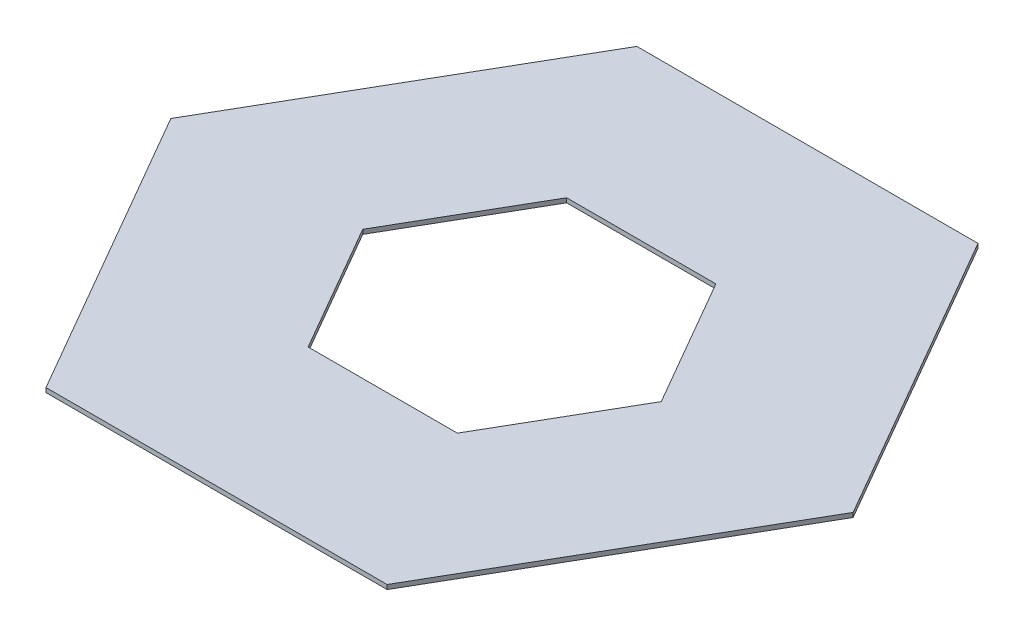
ISO-10303-21;
HEADER;
FILE_DESCRIPTION(('STEP AP214'),'2;1');
FILE_NAME('part.step','',(''),(''),'','','');
FILE_SCHEMA(('AUTOMOTIVE_DESIGN { 1 0 10303 214 1 1 1 1 }'));
ENDSEC;
DATA;
#1=APPLICATION_CONTEXT('core data for automotive mechanical design processes');
#2=APPLICATION_PROTOCOL_DEFINITION('international standard','automotive_design',2000,#1);
#3=PRODUCT_CONTEXT('',#1,'mechanical');
#4=PRODUCT('Part','Part','',(#3));
#5=PRODUCT_RELATED_PRODUCT_CATEGORY('part','',(#4));
#6=PRODUCT_DEFINITION_FORMATION('','',#4);
#7=PRODUCT_DEFINITION_CONTEXT('part definition',#1,'design');
#8=PRODUCT_DEFINITION('design','',#6,#7);
#9=PRODUCT_DEFINITION_SHAPE('','',#8);
#10=(LENGTH_UNIT() NAMED_UNIT(*) SI_UNIT(.MILLI.,.METRE.));
#11=(NAMED_UNIT(*) PLANE_ANGLE_UNIT() SI_UNIT($,.RADIAN.));
#12=(NAMED_UNIT(*) SI_UNIT($,.STERADIAN.) SOLID_ANGLE_UNIT());
#13=UNCERTAINTY_MEASURE_WITH_UNIT(LENGTH_MEASURE(1.E-05),#10,'distance_accuracy_value','');
#14=(GEOMETRIC_REPRESENTATION_CONTEXT(3) GLOBAL_UNCERTAINTY_ASSIGNED_CONTEXT((#13)) GLOBAL_UNIT_ASSIGNED_CONTEXT((#10,
#11,#12)) REPRESENTATION_CONTEXT('',''));
#15=CARTESIAN_POINT('',(0.,0.,0.));
#16=DIRECTION('',(0.,0.,1.));
#17=DIRECTION('',(1.,0.,0.));
#18=AXIS2_PLACEMENT_3D('',#15,#16,#17);
#19=CARTESIAN_POINT('',(115.470053837925,-18.,-200.));
#20=DIRECTION('',(0.,0.,-1.));
#21=DIRECTION('',(-1.,0.,0.));
#22=AXIS2_PLACEMENT_3D('',#19,#20,#21);
#23=PLANE('',#22);
#24=DIRECTION('',(-1.,0.,0.));
#25=VECTOR('',#24,1.);
#26=CARTESIAN_POINT('',(115.470053837925,-15.,-200.));
#27=LINE('',#26,#25);
#28=CARTESIAN_POINT('',(115.470053837925,-15.,-200.));
#29=VERTEX_POINT('',#28);
#30=CARTESIAN_POINT('',(-115.470053837925,-15.,-200.));
#31=VERTEX_POINT('',#30);
#32=EDGE_CURVE('E169',#29,#31,#27,.T.);
#33=ORIENTED_EDGE('',*,*,#32,.F.);
#34=DIRECTION('',(0.,1.,0.));
#35=VECTOR('',#34,1.);
#36=CARTESIAN_POINT('',(115.470053837925,-18.,-200.));
#37=LINE('',#36,#35);
#38=CARTESIAN_POINT('',(115.470053837925,-18.,-200.));
#39=VERTEX_POINT('',#38);
#40=EDGE_CURVE('E11',#39,#29,#37,.T.);
#41=ORIENTED_EDGE('',*,*,#40,.F.);
#42=DIRECTION('',(-1.,0.,0.));
#43=VECTOR('',#42,1.);
#44=CARTESIAN_POINT('',(115.470053837925,-18.,-200.));
#45=LINE('',#44,#43);
#46=CARTESIAN_POINT('',(-115.470053837925,-18.,-200.));
#47=VERTEX_POINT('',#46);
#48=EDGE_CURVE('E177',#39,#47,#45,.T.);
#49=ORIENTED_EDGE('',*,*,#48,.T.);
#50=DIRECTION('',(0.,1.,0.));
#51=VECTOR('',#50,1.);
#52=CARTESIAN_POINT('',(-115.470053837925,-18.,-200.));
#53=LINE('',#52,#51);
#54=EDGE_CURVE('E38',#47,#31,#53,.T.);
#55=ORIENTED_EDGE('',*,*,#54,.T.);
#56=EDGE_LOOP('',(#33,#41,#49,#55));
#57=FACE_BOUND('',#56,.T.);
#58=ADVANCED_FACE('F35',(#57),#23,.T.);
#59=CARTESIAN_POINT('',(230.94010767585,-18.,0.));
#60=DIRECTION('',(0.866025403784438,0.,-0.5));
#61=DIRECTION('',(-0.5,0.,-0.866025403784439));
#62=AXIS2_PLACEMENT_3D('',#59,#60,#61);
#63=PLANE('',#62);
#64=DIRECTION('',(-0.5,0.,-0.866025403784439));
#65=VECTOR('',#64,1.);
#66=CARTESIAN_POINT('',(230.94010767585,-15.,0.));
#67=LINE('',#66,#65);
#68=CARTESIAN_POINT('',(230.94010767585,-15.,0.));
#69=VERTEX_POINT('',#68);
#70=EDGE_CURVE('E181',#69,#29,#67,.T.);
#71=ORIENTED_EDGE('',*,*,#70,.F.);
#72=DIRECTION('',(0.,1.,0.));
#73=VECTOR('',#72,1.);
#74=CARTESIAN_POINT('',(230.94010767585,-18.,0.));
#75=LINE('',#74,#73);
#76=CARTESIAN_POINT('',(230.94010767585,-18.,0.));
#77=VERTEX_POINT('',#76);
#78=EDGE_CURVE('E43',#77,#69,#75,.T.);
#79=ORIENTED_EDGE('',*,*,#78,.F.);
#80=DIRECTION('',(-0.5,0.,-0.866025403784439));
#81=VECTOR('',#80,1.);
#82=CARTESIAN_POINT('',(230.94010767585,-18.,0.));
#83=LINE('',#82,#81);
#84=EDGE_CURVE('E193',#77,#39,#83,.T.);
#85=ORIENTED_EDGE('',*,*,#84,.T.);
#86=ORIENTED_EDGE('',*,*,#40,.T.);
#87=EDGE_LOOP('',(#71,#79,#85,#86));
#88=FACE_BOUND('',#87,.T.);
#89=ADVANCED_FACE('F230',(#88),#63,.T.);
#90=CARTESIAN_POINT('',(115.470053837925,-18.,200.));
#91=DIRECTION('',(0.866025403784439,0.,0.5));
#92=DIRECTION('',(0.5,0.,-0.866025403784439));
#93=AXIS2_PLACEMENT_3D('',#90,#91,#92);
#94=PLANE('',#93);
#95=DIRECTION('',(0.5,0.,-0.866025403784439));
#96=VECTOR('',#95,1.);
#97=CARTESIAN_POINT('',(115.470053837925,-15.,200.));
#98=LINE('',#97,#96);
#99=CARTESIAN_POINT('',(115.470053837925,-15.,200.));
#100=VERTEX_POINT('',#99);
#101=EDGE_CURVE('E207',#100,#69,#98,.T.);
#102=ORIENTED_EDGE('',*,*,#101,.F.);
#103=DIRECTION('',(0.,1.,0.));
#104=VECTOR('',#103,1.);
#105=CARTESIAN_POINT('',(115.470053837925,-18.,200.));
#106=LINE('',#105,#104);
#107=CARTESIAN_POINT('',(115.470053837925,-18.,200.));
#108=VERTEX_POINT('',#107);
#109=EDGE_CURVE('E213',#108,#100,#106,.T.);
#110=ORIENTED_EDGE('',*,*,#109,.F.);
#111=DIRECTION('',(0.5,0.,-0.866025403784439));
#112=VECTOR('',#111,1.);
#113=CARTESIAN_POINT('',(115.470053837925,-18.,200.));
#114=LINE('',#113,#112);
#115=EDGE_CURVE('E190',#108,#77,#114,.T.);
#116=ORIENTED_EDGE('',*,*,#115,.T.);
#117=ORIENTED_EDGE('',*,*,#78,.T.);
#118=EDGE_LOOP('',(#102,#110,#116,#117));
#119=FACE_BOUND('',#118,.T.);
#120=ADVANCED_FACE('F241',(#119),#94,.T.);
#121=CARTESIAN_POINT('',(-115.470053837925,-18.,200.));
#122=DIRECTION('',(0.,0.,1.));
#123=DIRECTION('',(1.,0.,0.));
#124=AXIS2_PLACEMENT_3D('',#121,#122,#123);
#125=PLANE('',#124);
#126=DIRECTION('',(1.,0.,0.));
#127=VECTOR('',#126,1.);
#128=CARTESIAN_POINT('',(-115.470053837925,-15.,200.));
#129=LINE('',#128,#127);
#130=CARTESIAN_POINT('',(-115.470053837925,-15.,200.));
#131=VERTEX_POINT('',#130);
#132=EDGE_CURVE('E204',#131,#100,#129,.T.);
#133=ORIENTED_EDGE('',*,*,#132,.F.);
#134=DIRECTION('',(0.,1.,0.));
#135=VECTOR('',#134,1.);
#136=CARTESIAN_POINT('',(-115.470053837925,-18.,200.));
#137=LINE('',#136,#135);
#138=CARTESIAN_POINT('',(-115.470053837925,-18.,200.));
#139=VERTEX_POINT('',#138);
#140=EDGE_CURVE('E215',#139,#131,#137,.T.);
#141=ORIENTED_EDGE('',*,*,#140,.F.);
#142=DIRECTION('',(1.,0.,0.));
#143=VECTOR('',#142,1.);
#144=CARTESIAN_POINT('',(-115.470053837925,-18.,200.));
#145=LINE('',#144,#143);
#146=EDGE_CURVE('E187',#139,#108,#145,.T.);
#147=ORIENTED_EDGE('',*,*,#146,.T.);
#148=ORIENTED_EDGE('',*,*,#109,.T.);
#149=EDGE_LOOP('',(#133,#141,#147,#148));
#150=FACE_BOUND('',#149,.T.);
#151=ADVANCED_FACE('F239',(#150),#125,.T.);
#152=CARTESIAN_POINT('',(-230.94010767585,-18.,0.));
#153=DIRECTION('',(-0.866025403784439,0.,0.5));
#154=DIRECTION('',(0.5,0.,0.866025403784439));
#155=AXIS2_PLACEMENT_3D('',#152,#153,#154);
#156=PLANE('',#155);
#157=DIRECTION('',(0.5,0.,0.866025403784438));
#158=VECTOR('',#157,1.);
#159=CARTESIAN_POINT('',(-230.94010767585,-15.,0.));
#160=LINE('',#159,#158);
#161=CARTESIAN_POINT('',(-230.94010767585,-15.,0.));
#162=VERTEX_POINT('',#161);
#163=EDGE_CURVE('E201',#162,#131,#160,.T.);
#164=ORIENTED_EDGE('',*,*,#163,.F.);
#165=DIRECTION('',(0.,1.,0.));
#166=VECTOR('',#165,1.);
#167=CARTESIAN_POINT('',(-230.94010767585,-18.,0.));
#168=LINE('',#167,#166);
#169=CARTESIAN_POINT('',(-230.94010767585,-18.,0.));
#170=VERTEX_POINT('',#169);
#171=EDGE_CURVE('E216',#170,#162,#168,.T.);
#172=ORIENTED_EDGE('',*,*,#171,.F.);
#173=DIRECTION('',(0.5,0.,0.866025403784438));
#174=VECTOR('',#173,1.);
#175=CARTESIAN_POINT('',(-230.94010767585,-18.,0.));
#176=LINE('',#175,#174);
#177=EDGE_CURVE('E184',#170,#139,#176,.T.);
#178=ORIENTED_EDGE('',*,*,#177,.T.);
#179=ORIENTED_EDGE('',*,*,#140,.T.);
#180=EDGE_LOOP('',(#164,#172,#178,#179));
#181=FACE_BOUND('',#180,.T.);
#182=ADVANCED_FACE('F236',(#181),#156,.T.);
#183=CARTESIAN_POINT('',(-115.470053837925,-18.,-200.));
#184=DIRECTION('',(-0.866025403784439,0.,-0.5));
#185=DIRECTION('',(-0.5,0.,0.866025403784439));
#186=AXIS2_PLACEMENT_3D('',#183,#184,#185);
#187=PLANE('',#186);
#188=DIRECTION('',(-0.5,0.,0.866025403784439));
#189=VECTOR('',#188,1.);
#190=CARTESIAN_POINT('',(-115.470053837925,-15.,-200.));
#191=LINE('',#190,#189);
#192=EDGE_CURVE('E198',#31,#162,#191,.T.);
#193=ORIENTED_EDGE('',*,*,#192,.F.);
#194=ORIENTED_EDGE('',*,*,#54,.F.);
#195=DIRECTION('',(-0.5,0.,0.866025403784439));
#196=VECTOR('',#195,1.);
#197=CARTESIAN_POINT('',(-115.470053837925,-18.,-200.));
#198=LINE('',#197,#196);
#199=EDGE_CURVE('E180',#47,#170,#198,.T.);
#200=ORIENTED_EDGE('',*,*,#199,.T.);
#201=ORIENTED_EDGE('',*,*,#171,.T.);
#202=EDGE_LOOP('',(#193,#194,#200,#201));
#203=FACE_BOUND('',#202,.T.);
#204=ADVANCED_FACE('F224',(#203),#187,.T.);
#205=CARTESIAN_POINT('',(0.,-18.,0.));
#206=DIRECTION('',(0.,1.,0.));
#207=DIRECTION('',(0.,0.,1.));
#208=AXIS2_PLACEMENT_3D('',#205,#206,#207);
#209=PLANE('',#208);
#210=DIRECTION('',(-0.5,0.,-0.866025403784439));
#211=VECTOR('',#210,1.);
#212=CARTESIAN_POINT('',(101.036297108185,-18.,0.));
#213=LINE('',#212,#211);
#214=CARTESIAN_POINT('',(101.036297108185,-18.,0.));
#215=VERTEX_POINT('',#214);
#216=CARTESIAN_POINT('',(50.5181485540923,-18.,-87.5));
#217=VERTEX_POINT('',#216);
#218=EDGE_CURVE('E132',#215,#217,#213,.T.);
#219=ORIENTED_EDGE('',*,*,#218,.T.);
#220=DIRECTION('',(-1.,0.,0.));
#221=VECTOR('',#220,1.);
#222=CARTESIAN_POINT('',(50.5181485540923,-18.,-87.5));
#223=LINE('',#222,#221);
#224=CARTESIAN_POINT('',(-50.5181485540922,-18.,-87.5));
#225=VERTEX_POINT('',#224);
#226=EDGE_CURVE('E126',#217,#225,#223,.T.);
#227=ORIENTED_EDGE('',*,*,#226,.T.);
#228=DIRECTION('',(-0.5,0.,0.866025403784438));
#229=VECTOR('',#228,1.);
#230=CARTESIAN_POINT('',(-50.5181485540922,-18.,-87.5));
#231=LINE('',#230,#229);
#232=CARTESIAN_POINT('',(-101.036297108185,-18.,0.));
#233=VERTEX_POINT('',#232);
#234=EDGE_CURVE('E135',#225,#233,#231,.T.);
#235=ORIENTED_EDGE('',*,*,#234,.T.);
#236=DIRECTION('',(0.5,0.,0.866025403784439));
#237=VECTOR('',#236,1.);
#238=CARTESIAN_POINT('',(-101.036297108185,-18.,0.));
#239=LINE('',#238,#237);
#240=CARTESIAN_POINT('',(-50.5181485540923,-18.,87.5));
#241=VERTEX_POINT('',#240);
#242=EDGE_CURVE('E51',#233,#241,#239,.T.);
#243=ORIENTED_EDGE('',*,*,#242,.T.);
#244=DIRECTION('',(1.,0.,0.));
#245=VECTOR('',#244,1.);
#246=CARTESIAN_POINT('',(-50.5181485540923,-18.,87.5));
#247=LINE('',#246,#245);
#248=CARTESIAN_POINT('',(50.5181485540922,-18.,87.5));
#249=VERTEX_POINT('',#248);
#250=EDGE_CURVE('E150',#241,#249,#247,.T.);
#251=ORIENTED_EDGE('',*,*,#250,.T.);
#252=DIRECTION('',(0.500000000000001,0.,-0.866025403784438));
#253=VECTOR('',#252,1.);
#254=CARTESIAN_POINT('',(50.5181485540922,-18.,87.5));
#255=LINE('',#254,#253);
#256=EDGE_CURVE('E153',#249,#215,#255,.T.);
#257=ORIENTED_EDGE('',*,*,#256,.T.);
#258=EDGE_LOOP('',(#219,#227,#235,#243,#251,#257));
#259=FACE_BOUND('',#258,.T.);
#260=ORIENTED_EDGE('',*,*,#48,.F.);
#261=ORIENTED_EDGE('',*,*,#84,.F.);
#262=ORIENTED_EDGE('',*,*,#115,.F.);
#263=ORIENTED_EDGE('',*,*,#146,.F.);
#264=ORIENTED_EDGE('',*,*,#177,.F.);
#265=ORIENTED_EDGE('',*,*,#199,.F.);
#266=EDGE_LOOP('',(#260,#261,#262,#263,#264,#265));
#267=FACE_BOUND('',#266,.T.);
#268=ADVANCED_FACE('F139',(#259,#267),#209,.F.);
#269=CARTESIAN_POINT('',(0.,-15.,0.));
#270=DIRECTION('',(0.,1.,0.));
#271=DIRECTION('',(0.,0.,1.));
#272=AXIS2_PLACEMENT_3D('',#269,#270,#271);
#273=PLANE('',#272);
#274=DIRECTION('',(-1.,0.,0.));
#275=VECTOR('',#274,1.);
#276=CARTESIAN_POINT('',(50.5181485540923,-15.,-87.5));
#277=LINE('',#276,#275);
#278=CARTESIAN_POINT('',(50.5181485540923,-15.,-87.5));
#279=VERTEX_POINT('',#278);
#280=CARTESIAN_POINT('',(-50.5181485540923,-15.,-87.5));
#281=VERTEX_POINT('',#280);
#282=EDGE_CURVE('E59',#279,#281,#277,.T.);
#283=ORIENTED_EDGE('',*,*,#282,.F.);
#284=DIRECTION('',(-0.5,0.,-0.866025403784439));
#285=VECTOR('',#284,1.);
#286=CARTESIAN_POINT('',(101.036297108185,-15.,0.));
#287=LINE('',#286,#285);
#288=CARTESIAN_POINT('',(101.036297108185,-15.,0.));
#289=VERTEX_POINT('',#288);
#290=EDGE_CURVE('E143',#289,#279,#287,.T.);
#291=ORIENTED_EDGE('',*,*,#290,.F.);
#292=DIRECTION('',(0.500000000000001,0.,-0.866025403784438));
#293=VECTOR('',#292,1.);
#294=CARTESIAN_POINT('',(50.5181485540922,-15.,87.5));
#295=LINE('',#294,#293);
#296=CARTESIAN_POINT('',(50.5181485540922,-15.,87.5));
#297=VERTEX_POINT('',#296);
#298=EDGE_CURVE('E146',#297,#289,#295,.T.);
#299=ORIENTED_EDGE('',*,*,#298,.F.);
#300=DIRECTION('',(1.,0.,0.));
#301=VECTOR('',#300,1.);
#302=CARTESIAN_POINT('',(-50.5181485540923,-15.,87.5));
#303=LINE('',#302,#301);
#304=CARTESIAN_POINT('',(-50.5181485540923,-15.,87.5));
#305=VERTEX_POINT('',#304);
#306=EDGE_CURVE('E162',#305,#297,#303,.T.);
#307=ORIENTED_EDGE('',*,*,#306,.F.);
#308=DIRECTION('',(0.5,0.,0.866025403784439));
#309=VECTOR('',#308,1.);
#310=CARTESIAN_POINT('',(-101.036297108185,-15.,0.));
#311=LINE('',#310,#309);
#312=CARTESIAN_POINT('',(-101.036297108185,-15.,0.));
#313=VERTEX_POINT('',#312);
#314=EDGE_CURVE('E159',#313,#305,#311,.T.);
#315=ORIENTED_EDGE('',*,*,#314,.F.);
#316=DIRECTION('',(-0.5,0.,0.866025403784438));
#317=VECTOR('',#316,1.);
#318=CARTESIAN_POINT('',(-50.5181485540922,-15.,-87.5));
#319=LINE('',#318,#317);
#320=EDGE_CURVE('E157',#281,#313,#319,.T.);
#321=ORIENTED_EDGE('',*,*,#320,.F.);
#322=EDGE_LOOP('',(#283,#291,#299,#307,#315,#321));
#323=FACE_BOUND('',#322,.T.);
#324=ORIENTED_EDGE('',*,*,#32,.T.);
#325=ORIENTED_EDGE('',*,*,#192,.T.);
#326=ORIENTED_EDGE('',*,*,#163,.T.);
#327=ORIENTED_EDGE('',*,*,#132,.T.);
#328=ORIENTED_EDGE('',*,*,#101,.T.);
#329=ORIENTED_EDGE('',*,*,#70,.T.);
#330=EDGE_LOOP('',(#324,#325,#326,#327,#328,#329));
#331=FACE_BOUND('',#330,.T.);
#332=ADVANCED_FACE('F226',(#323,#331),#273,.T.);
#333=CARTESIAN_POINT('',(50.5181485540923,-18.,-87.5));
#334=DIRECTION('',(0.,0.,-1.));
#335=DIRECTION('',(-1.,0.,0.));
#336=AXIS2_PLACEMENT_3D('',#333,#334,#335);
#337=PLANE('',#336);
#338=ORIENTED_EDGE('',*,*,#282,.T.);
#339=DIRECTION('',(0.,1.,0.));
#340=VECTOR('',#339,1.);
#341=CARTESIAN_POINT('',(-50.5181485540922,-18.,-87.5));
#342=LINE('',#341,#340);
#343=EDGE_CURVE('E122',#225,#281,#342,.T.);
#344=ORIENTED_EDGE('',*,*,#343,.F.);
#345=ORIENTED_EDGE('',*,*,#226,.F.);
#346=DIRECTION('',(0.,1.,0.));
#347=VECTOR('',#346,1.);
#348=CARTESIAN_POINT('',(50.5181485540923,-18.,-87.5));
#349=LINE('',#348,#347);
#350=EDGE_CURVE('E167',#217,#279,#349,.T.);
#351=ORIENTED_EDGE('',*,*,#350,.T.);
#352=EDGE_LOOP('',(#338,#344,#345,#351));
#353=FACE_BOUND('',#352,.T.);
#354=ADVANCED_FACE('F124',(#353),#337,.F.);
#355=CARTESIAN_POINT('',(101.036297108185,-18.,0.));
#356=DIRECTION('',(0.866025403784439,0.,-0.5));
#357=DIRECTION('',(-0.5,0.,-0.866025403784439));
#358=AXIS2_PLACEMENT_3D('',#355,#356,#357);
#359=PLANE('',#358);
#360=ORIENTED_EDGE('',*,*,#290,.T.);
#361=ORIENTED_EDGE('',*,*,#350,.F.);
#362=ORIENTED_EDGE('',*,*,#218,.F.);
#363=DIRECTION('',(0.,1.,0.));
#364=VECTOR('',#363,1.);
#365=CARTESIAN_POINT('',(101.036297108185,-18.,0.));
#366=LINE('',#365,#364);
#367=EDGE_CURVE('E170',#215,#289,#366,.T.);
#368=ORIENTED_EDGE('',*,*,#367,.T.);
#369=EDGE_LOOP('',(#360,#361,#362,#368));
#370=FACE_BOUND('',#369,.T.);
#371=ADVANCED_FACE('F308',(#370),#359,.F.);
#372=CARTESIAN_POINT('',(50.5181485540922,-18.,87.5));
#373=DIRECTION('',(0.866025403784438,0.,0.500000000000001));
#374=DIRECTION('',(0.500000000000001,0.,-0.866025403784438));
#375=AXIS2_PLACEMENT_3D('',#372,#373,#374);
#376=PLANE('',#375);
#377=ORIENTED_EDGE('',*,*,#298,.T.);
#378=ORIENTED_EDGE('',*,*,#367,.F.);
#379=ORIENTED_EDGE('',*,*,#256,.F.);
#380=DIRECTION('',(0.,1.,0.));
#381=VECTOR('',#380,1.);
#382=CARTESIAN_POINT('',(50.5181485540922,-18.,87.5));
#383=LINE('',#382,#381);
#384=EDGE_CURVE('E172',#249,#297,#383,.T.);
#385=ORIENTED_EDGE('',*,*,#384,.T.);
#386=EDGE_LOOP('',(#377,#378,#379,#385));
#387=FACE_BOUND('',#386,.T.);
#388=ADVANCED_FACE('F317',(#387),#376,.F.);
#389=CARTESIAN_POINT('',(-50.5181485540923,-18.,87.5));
#390=DIRECTION('',(0.,0.,1.));
#391=DIRECTION('',(1.,0.,0.));
#392=AXIS2_PLACEMENT_3D('',#389,#390,#391);
#393=PLANE('',#392);
#394=ORIENTED_EDGE('',*,*,#306,.T.);
#395=ORIENTED_EDGE('',*,*,#384,.F.);
#396=ORIENTED_EDGE('',*,*,#250,.F.);
#397=DIRECTION('',(0.,1.,0.));
#398=VECTOR('',#397,1.);
#399=CARTESIAN_POINT('',(-50.5181485540923,-18.,87.5));
#400=LINE('',#399,#398);
#401=EDGE_CURVE('E174',#241,#305,#400,.T.);
#402=ORIENTED_EDGE('',*,*,#401,.T.);
#403=EDGE_LOOP('',(#394,#395,#396,#402));
#404=FACE_BOUND('',#403,.T.);
#405=ADVANCED_FACE('F327',(#404),#393,.F.);
#406=CARTESIAN_POINT('',(-101.036297108185,-18.,0.));
#407=DIRECTION('',(-0.866025403784439,0.,0.5));
#408=DIRECTION('',(0.5,0.,0.866025403784439));
#409=AXIS2_PLACEMENT_3D('',#406,#407,#408);
#410=PLANE('',#409);
#411=ORIENTED_EDGE('',*,*,#314,.T.);
#412=ORIENTED_EDGE('',*,*,#401,.F.);
#413=ORIENTED_EDGE('',*,*,#242,.F.);
#414=DIRECTION('',(0.,1.,0.));
#415=VECTOR('',#414,1.);
#416=CARTESIAN_POINT('',(-101.036297108185,-18.,0.));
#417=LINE('',#416,#415);
#418=EDGE_CURVE('E131',#233,#313,#417,.T.);
#419=ORIENTED_EDGE('',*,*,#418,.T.);
#420=EDGE_LOOP('',(#411,#412,#413,#419));
#421=FACE_BOUND('',#420,.T.);
#422=ADVANCED_FACE('F337',(#421),#410,.F.);
#423=CARTESIAN_POINT('',(-50.5181485540922,-18.,-87.5));
#424=DIRECTION('',(-0.866025403784438,0.,-0.5));
#425=DIRECTION('',(-0.5,0.,0.866025403784438));
#426=AXIS2_PLACEMENT_3D('',#423,#424,#425);
#427=PLANE('',#426);
#428=ORIENTED_EDGE('',*,*,#320,.T.);
#429=ORIENTED_EDGE('',*,*,#418,.F.);
#430=ORIENTED_EDGE('',*,*,#234,.F.);
#431=ORIENTED_EDGE('',*,*,#343,.T.);
#432=EDGE_LOOP('',(#428,#429,#430,#431));
#433=FACE_BOUND('',#432,.T.);
#434=ADVANCED_FACE('F136',(#433),#427,.F.);
#435=CLOSED_SHELL('',(#58,#89,#120,#151,#182,#204,#268,#332,#354,#371,#388,#405,#422,#434));
#436=MANIFOLD_SOLID_BREP('B2',#435);
#437=ADVANCED_BREP_SHAPE_REPRESENTATION('',(#18,#436),#14);
#438=SHAPE_DEFINITION_REPRESENTATION(#9,#437);
ENDSEC;
END-ISO-10303-21;
